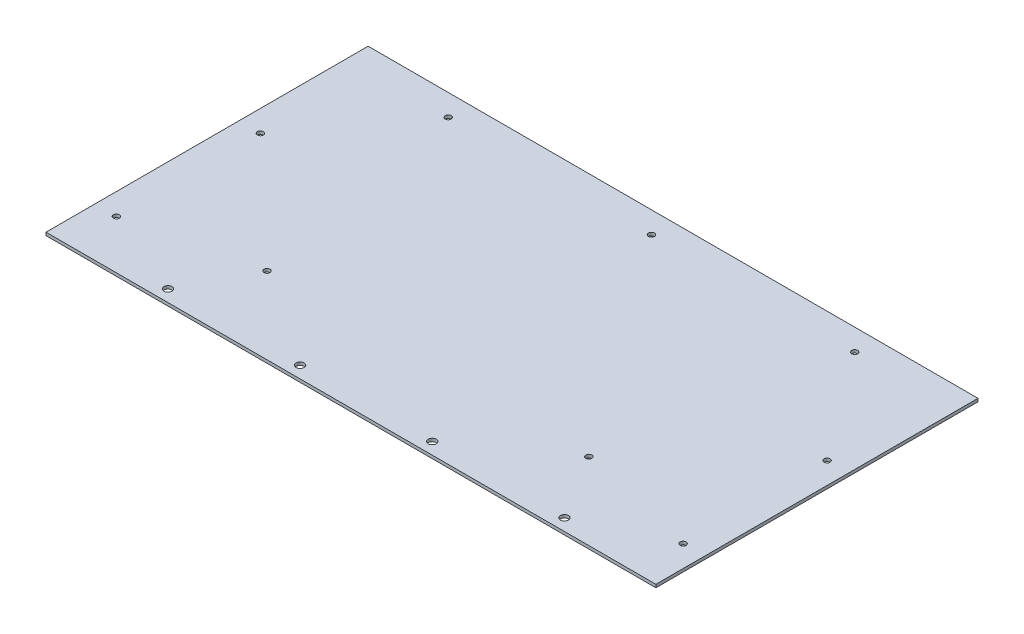
ISO-10303-21;
HEADER;
FILE_DESCRIPTION(('STEP AP214'),'2;1');
FILE_NAME('part.step','',(''),(''),'','','');
FILE_SCHEMA(('AUTOMOTIVE_DESIGN { 1 0 10303 214 1 1 1 1 }'));
ENDSEC;
DATA;
#1=APPLICATION_CONTEXT('core data for automotive mechanical design processes');
#2=APPLICATION_PROTOCOL_DEFINITION('international standard','automotive_design',2000,#1);
#3=PRODUCT_CONTEXT('',#1,'mechanical');
#4=PRODUCT('Part','Part','',(#3));
#5=PRODUCT_RELATED_PRODUCT_CATEGORY('part','',(#4));
#6=PRODUCT_DEFINITION_FORMATION('','',#4);
#7=PRODUCT_DEFINITION_CONTEXT('part definition',#1,'design');
#8=PRODUCT_DEFINITION('design','',#6,#7);
#9=PRODUCT_DEFINITION_SHAPE('','',#8);
#10=(LENGTH_UNIT() NAMED_UNIT(*) SI_UNIT(.MILLI.,.METRE.));
#11=(NAMED_UNIT(*) PLANE_ANGLE_UNIT() SI_UNIT($,.RADIAN.));
#12=(NAMED_UNIT(*) SI_UNIT($,.STERADIAN.) SOLID_ANGLE_UNIT());
#13=UNCERTAINTY_MEASURE_WITH_UNIT(LENGTH_MEASURE(1.E-05),#10,'distance_accuracy_value','');
#14=(GEOMETRIC_REPRESENTATION_CONTEXT(3) GLOBAL_UNCERTAINTY_ASSIGNED_CONTEXT((#13)) GLOBAL_UNIT_ASSIGNED_CONTEXT((#10,
#11,#12)) REPRESENTATION_CONTEXT('',''));
#15=CARTESIAN_POINT('',(0.,0.,0.));
#16=DIRECTION('',(0.,0.,1.));
#17=DIRECTION('',(1.,0.,0.));
#18=AXIS2_PLACEMENT_3D('',#15,#16,#17);
#19=CARTESIAN_POINT('',(-228.6,-1.143,238.315200026));
#20=DIRECTION('',(0.,1.,0.));
#21=DIRECTION('',(0.,0.,1.));
#22=AXIS2_PLACEMENT_3D('',#19,#20,#21);
#23=PLANE('',#22);
#24=CARTESIAN_POINT('',(-212.419,-1.143,93.7748237783918));
#25=DIRECTION('',(0.,-1.,0.));
#26=DIRECTION('',(0.,0.,-1.));
#27=AXIS2_PLACEMENT_3D('',#24,#25,#26);
#28=CIRCLE('',#27,2.25);
#29=CARTESIAN_POINT('',(-212.419,-1.143,91.5248237783918));
#30=VERTEX_POINT('',#29);
#31=EDGE_CURVE('E217',#30,#30,#28,.T.);
#32=ORIENTED_EDGE('',*,*,#31,.F.);
#33=EDGE_LOOP('',(#32));
#34=FACE_BOUND('',#33,.T.);
#35=CARTESIAN_POINT('',(-152.399999999999,-1.143,13.0175));
#36=DIRECTION('',(0.,-1.,0.));
#37=DIRECTION('',(0.,0.,-1.));
#38=AXIS2_PLACEMENT_3D('',#35,#36,#37);
#39=CIRCLE('',#38,2.25);
#40=CARTESIAN_POINT('',(-152.399999999999,-1.143,10.7675));
#41=VERTEX_POINT('',#40);
#42=EDGE_CURVE('E219',#41,#41,#39,.T.);
#43=ORIENTED_EDGE('',*,*,#42,.F.);
#44=EDGE_LOOP('',(#43));
#45=FACE_BOUND('',#44,.T.);
#46=CARTESIAN_POINT('',(1.34681673997592E-12,-1.143,13.0175));
#47=DIRECTION('',(0.,-1.,0.));
#48=DIRECTION('',(0.,0.,-1.));
#49=AXIS2_PLACEMENT_3D('',#46,#47,#48);
#50=CIRCLE('',#49,2.25);
#51=CARTESIAN_POINT('',(1.34681673997592E-12,-1.143,10.7675));
#52=VERTEX_POINT('',#51);
#53=EDGE_CURVE('E227',#52,#52,#50,.T.);
#54=ORIENTED_EDGE('',*,*,#53,.F.);
#55=EDGE_LOOP('',(#54));
#56=FACE_BOUND('',#55,.T.);
#57=CARTESIAN_POINT('',(152.400000000001,-1.143,13.0175));
#58=DIRECTION('',(0.,-1.,0.));
#59=DIRECTION('',(0.,0.,-1.));
#60=AXIS2_PLACEMENT_3D('',#57,#58,#59);
#61=CIRCLE('',#60,2.25);
#62=CARTESIAN_POINT('',(152.400000000001,-1.143,10.7675));
#63=VERTEX_POINT('',#62);
#64=EDGE_CURVE('E233',#63,#63,#61,.T.);
#65=ORIENTED_EDGE('',*,*,#64,.F.);
#66=EDGE_LOOP('',(#65));
#67=FACE_BOUND('',#66,.T.);
#68=CARTESIAN_POINT('',(212.419,-1.143,93.7748237783918));
#69=DIRECTION('',(0.,-1.,0.));
#70=DIRECTION('',(0.,0.,-1.));
#71=AXIS2_PLACEMENT_3D('',#68,#69,#70);
#72=CIRCLE('',#71,2.25);
#73=CARTESIAN_POINT('',(212.419,-1.143,91.5248237783918));
#74=VERTEX_POINT('',#73);
#75=EDGE_CURVE('E239',#74,#74,#72,.T.);
#76=ORIENTED_EDGE('',*,*,#75,.F.);
#77=EDGE_LOOP('',(#76));
#78=FACE_BOUND('',#77,.T.);
#79=CARTESIAN_POINT('',(-212.419,-1.143,201.724823778392));
#80=DIRECTION('',(0.,-1.,0.));
#81=DIRECTION('',(0.,0.,-1.));
#82=AXIS2_PLACEMENT_3D('',#79,#80,#81);
#83=CIRCLE('',#82,2.25);
#84=CARTESIAN_POINT('',(-212.419,-1.143,199.474823778392));
#85=VERTEX_POINT('',#84);
#86=EDGE_CURVE('E263',#85,#85,#83,.T.);
#87=ORIENTED_EDGE('',*,*,#86,.F.);
#88=EDGE_LOOP('',(#87));
#89=FACE_BOUND('',#88,.T.);
#90=CARTESIAN_POINT('',(-46.99,-1.143,229.425200026));
#91=DIRECTION('',(0.,1.,0.));
#92=DIRECTION('',(0.,0.,1.));
#93=AXIS2_PLACEMENT_3D('',#90,#91,#92);
#94=CIRCLE('',#93,2.99999999999999);
#95=CARTESIAN_POINT('',(-46.99,-1.143,232.425200026));
#96=VERTEX_POINT('',#95);
#97=EDGE_CURVE('E271',#96,#96,#94,.T.);
#98=ORIENTED_EDGE('',*,*,#97,.T.);
#99=EDGE_LOOP('',(#98));
#100=FACE_BOUND('',#99,.T.);
#101=CARTESIAN_POINT('',(-146.05,-1.143,229.425200026));
#102=DIRECTION('',(0.,1.,0.));
#103=DIRECTION('',(0.,0.,1.));
#104=AXIS2_PLACEMENT_3D('',#101,#102,#103);
#105=CIRCLE('',#104,2.99999999999999);
#106=CARTESIAN_POINT('',(-146.05,-1.143,232.425200026));
#107=VERTEX_POINT('',#106);
#108=EDGE_CURVE('E112',#107,#107,#105,.T.);
#109=ORIENTED_EDGE('',*,*,#108,.T.);
#110=EDGE_LOOP('',(#109));
#111=FACE_BOUND('',#110,.T.);
#112=DIRECTION('',(0.,0.,-1.));
#113=VECTOR('',#112,1.);
#114=CARTESIAN_POINT('',(-228.6,-1.143,238.315200026));
#115=LINE('',#114,#113);
#116=CARTESIAN_POINT('',(-228.6,-1.143,238.315200026));
#117=VERTEX_POINT('',#116);
#118=CARTESIAN_POINT('',(-228.6,-1.143,-3.175));
#119=VERTEX_POINT('',#118);
#120=EDGE_CURVE('E128',#117,#119,#115,.T.);
#121=ORIENTED_EDGE('',*,*,#120,.T.);
#122=DIRECTION('',(-1.,0.,0.));
#123=VECTOR('',#122,1.);
#124=CARTESIAN_POINT('',(0.,-1.143,-3.175));
#125=LINE('',#124,#123);
#126=CARTESIAN_POINT('',(228.6,-1.143,-3.175));
#127=VERTEX_POINT('',#126);
#128=EDGE_CURVE('E106',#127,#119,#125,.T.);
#129=ORIENTED_EDGE('',*,*,#128,.F.);
#130=DIRECTION('',(0.,0.,-1.));
#131=VECTOR('',#130,1.);
#132=CARTESIAN_POINT('',(228.6,-1.143,238.315200026));
#133=LINE('',#132,#131);
#134=CARTESIAN_POINT('',(228.6,-1.143,238.315200026));
#135=VERTEX_POINT('',#134);
#136=EDGE_CURVE('E102',#135,#127,#133,.T.);
#137=ORIENTED_EDGE('',*,*,#136,.F.);
#138=DIRECTION('',(1.,0.,0.));
#139=VECTOR('',#138,1.);
#140=CARTESIAN_POINT('',(-228.6,-1.143,238.315200026));
#141=LINE('',#140,#139);
#142=EDGE_CURVE('E60',#117,#135,#141,.T.);
#143=ORIENTED_EDGE('',*,*,#142,.F.);
#144=EDGE_LOOP('',(#121,#129,#137,#143));
#145=FACE_BOUND('',#144,.T.);
#146=CARTESIAN_POINT('',(52.07,-1.143,229.425200026));
#147=DIRECTION('',(0.,1.,0.));
#148=DIRECTION('',(0.,0.,1.));
#149=AXIS2_PLACEMENT_3D('',#146,#147,#148);
#150=CIRCLE('',#149,2.99999999999999);
#151=CARTESIAN_POINT('',(52.07,-1.143,232.425200026));
#152=VERTEX_POINT('',#151);
#153=EDGE_CURVE('E133',#152,#152,#150,.T.);
#154=ORIENTED_EDGE('',*,*,#153,.T.);
#155=EDGE_LOOP('',(#154));
#156=FACE_BOUND('',#155,.T.);
#157=CARTESIAN_POINT('',(151.13,-1.143,229.425200026));
#158=DIRECTION('',(0.,1.,0.));
#159=DIRECTION('',(0.,0.,1.));
#160=AXIS2_PLACEMENT_3D('',#157,#158,#159);
#161=CIRCLE('',#160,2.99999999999999);
#162=CARTESIAN_POINT('',(151.13,-1.143,232.425200026));
#163=VERTEX_POINT('',#162);
#164=EDGE_CURVE('E11',#163,#163,#161,.T.);
#165=ORIENTED_EDGE('',*,*,#164,.T.);
#166=EDGE_LOOP('',(#165));
#167=FACE_BOUND('',#166,.T.);
#168=CARTESIAN_POINT('',(-120.65,-1.143,180.586));
#169=DIRECTION('',(0.,-1.,0.));
#170=DIRECTION('',(0.,0.,-1.));
#171=AXIS2_PLACEMENT_3D('',#168,#169,#170);
#172=CIRCLE('',#171,2.25);
#173=CARTESIAN_POINT('',(-120.65,-1.143,178.336));
#174=VERTEX_POINT('',#173);
#175=EDGE_CURVE('E257',#174,#174,#172,.T.);
#176=ORIENTED_EDGE('',*,*,#175,.F.);
#177=EDGE_LOOP('',(#176));
#178=FACE_BOUND('',#177,.T.);
#179=CARTESIAN_POINT('',(120.65,-1.143,180.586));
#180=DIRECTION('',(0.,-1.,0.));
#181=DIRECTION('',(0.,0.,-1.));
#182=AXIS2_PLACEMENT_3D('',#179,#180,#181);
#183=CIRCLE('',#182,2.25);
#184=CARTESIAN_POINT('',(120.65,-1.143,178.336));
#185=VERTEX_POINT('',#184);
#186=EDGE_CURVE('E251',#185,#185,#183,.T.);
#187=ORIENTED_EDGE('',*,*,#186,.F.);
#188=EDGE_LOOP('',(#187));
#189=FACE_BOUND('',#188,.T.);
#190=CARTESIAN_POINT('',(212.419,-1.143,201.724823778392));
#191=DIRECTION('',(0.,-1.,0.));
#192=DIRECTION('',(0.,0.,-1.));
#193=AXIS2_PLACEMENT_3D('',#190,#191,#192);
#194=CIRCLE('',#193,2.25);
#195=CARTESIAN_POINT('',(212.419,-1.143,199.474823778392));
#196=VERTEX_POINT('',#195);
#197=EDGE_CURVE('E245',#196,#196,#194,.T.);
#198=ORIENTED_EDGE('',*,*,#197,.F.);
#199=EDGE_LOOP('',(#198));
#200=FACE_BOUND('',#199,.T.);
#201=ADVANCED_FACE('F45',(#34,#45,#56,#67,#78,#89,#100,#111,#145,#156,#167,#178,#189,#200),#23,.F.);
#202=CARTESIAN_POINT('',(151.13,-1.397,229.425200026));
#203=DIRECTION('',(0.,1.,0.));
#204=DIRECTION('',(0.,0.,1.));
#205=AXIS2_PLACEMENT_3D('',#202,#203,#204);
#206=CYLINDRICAL_SURFACE('',#205,2.99999999999999);
#207=CARTESIAN_POINT('',(151.13,1.143,229.425200026));
#208=DIRECTION('',(0.,1.,0.));
#209=DIRECTION('',(0.,0.,1.));
#210=AXIS2_PLACEMENT_3D('',#207,#208,#209);
#211=CIRCLE('',#210,2.99999999999999);
#212=CARTESIAN_POINT('',(151.13,1.143,232.425200026));
#213=VERTEX_POINT('',#212);
#214=EDGE_CURVE('E53',#213,#213,#211,.T.);
#215=ORIENTED_EDGE('',*,*,#214,.T.);
#216=EDGE_LOOP('',(#215));
#217=FACE_BOUND('',#216,.T.);
#218=ORIENTED_EDGE('',*,*,#164,.F.);
#219=EDGE_LOOP('',(#218));
#220=FACE_BOUND('',#219,.T.);
#221=ADVANCED_FACE('F47',(#217,#220),#206,.F.);
#222=CARTESIAN_POINT('',(52.07,-1.397,229.425200026));
#223=DIRECTION('',(0.,1.,0.));
#224=DIRECTION('',(0.,0.,1.));
#225=AXIS2_PLACEMENT_3D('',#222,#223,#224);
#226=CYLINDRICAL_SURFACE('',#225,2.99999999999999);
#227=CARTESIAN_POINT('',(52.07,1.143,229.425200026));
#228=DIRECTION('',(0.,1.,0.));
#229=DIRECTION('',(0.,0.,1.));
#230=AXIS2_PLACEMENT_3D('',#227,#228,#229);
#231=CIRCLE('',#230,2.99999999999999);
#232=CARTESIAN_POINT('',(52.07,1.143,232.425200026));
#233=VERTEX_POINT('',#232);
#234=EDGE_CURVE('E96',#233,#233,#231,.T.);
#235=ORIENTED_EDGE('',*,*,#234,.T.);
#236=EDGE_LOOP('',(#235));
#237=FACE_BOUND('',#236,.T.);
#238=ORIENTED_EDGE('',*,*,#153,.F.);
#239=EDGE_LOOP('',(#238));
#240=FACE_BOUND('',#239,.T.);
#241=ADVANCED_FACE('F153',(#237,#240),#226,.F.);
#242=CARTESIAN_POINT('',(228.6,-1.143,238.315200026));
#243=DIRECTION('',(-1.,0.,0.));
#244=DIRECTION('',(0.,0.,1.));
#245=AXIS2_PLACEMENT_3D('',#242,#243,#244);
#246=PLANE('',#245);
#247=ORIENTED_EDGE('',*,*,#136,.T.);
#248=DIRECTION('',(0.,-1.,0.));
#249=VECTOR('',#248,1.);
#250=CARTESIAN_POINT('',(228.6,0.,-3.175));
#251=LINE('',#250,#249);
#252=CARTESIAN_POINT('',(228.6,1.143,-3.175));
#253=VERTEX_POINT('',#252);
#254=EDGE_CURVE('E100',#253,#127,#251,.T.);
#255=ORIENTED_EDGE('',*,*,#254,.F.);
#256=DIRECTION('',(0.,0.,-1.));
#257=VECTOR('',#256,1.);
#258=CARTESIAN_POINT('',(228.6,1.143,238.315200026));
#259=LINE('',#258,#257);
#260=CARTESIAN_POINT('',(228.6,1.143,238.315200026));
#261=VERTEX_POINT('',#260);
#262=EDGE_CURVE('E86',#261,#253,#259,.T.);
#263=ORIENTED_EDGE('',*,*,#262,.F.);
#264=DIRECTION('',(0.,1.,0.));
#265=VECTOR('',#264,1.);
#266=CARTESIAN_POINT('',(228.6,-1.143,238.315200026));
#267=LINE('',#266,#265);
#268=EDGE_CURVE('E122',#135,#261,#267,.T.);
#269=ORIENTED_EDGE('',*,*,#268,.F.);
#270=EDGE_LOOP('',(#247,#255,#263,#269));
#271=FACE_BOUND('',#270,.T.);
#272=ADVANCED_FACE('F101',(#271),#246,.F.);
#273=CARTESIAN_POINT('',(-228.6,1.143,238.315200026));
#274=DIRECTION('',(0.,-1.,0.));
#275=DIRECTION('',(0.,0.,-1.));
#276=AXIS2_PLACEMENT_3D('',#273,#274,#275);
#277=PLANE('',#276);
#278=CARTESIAN_POINT('',(-212.419,1.143,93.7748237783918));
#279=DIRECTION('',(0.,-1.,0.));
#280=DIRECTION('',(0.,0.,-1.));
#281=AXIS2_PLACEMENT_3D('',#278,#279,#280);
#282=CIRCLE('',#281,2.25);
#283=CARTESIAN_POINT('',(-212.419,1.143,91.5248237783918));
#284=VERTEX_POINT('',#283);
#285=EDGE_CURVE('E215',#284,#284,#282,.T.);
#286=ORIENTED_EDGE('',*,*,#285,.T.);
#287=EDGE_LOOP('',(#286));
#288=FACE_BOUND('',#287,.T.);
#289=CARTESIAN_POINT('',(-152.399999999999,1.143,13.0175));
#290=DIRECTION('',(0.,-1.,0.));
#291=DIRECTION('',(0.,0.,-1.));
#292=AXIS2_PLACEMENT_3D('',#289,#290,#291);
#293=CIRCLE('',#292,2.25);
#294=CARTESIAN_POINT('',(-152.399999999999,1.143,10.7675));
#295=VERTEX_POINT('',#294);
#296=EDGE_CURVE('E224',#295,#295,#293,.T.);
#297=ORIENTED_EDGE('',*,*,#296,.T.);
#298=EDGE_LOOP('',(#297));
#299=FACE_BOUND('',#298,.T.);
#300=CARTESIAN_POINT('',(1.34681673997592E-12,1.143,13.0175));
#301=DIRECTION('',(0.,-1.,0.));
#302=DIRECTION('',(0.,0.,-1.));
#303=AXIS2_PLACEMENT_3D('',#300,#301,#302);
#304=CIRCLE('',#303,2.25);
#305=CARTESIAN_POINT('',(1.34681673997592E-12,1.143,10.7675));
#306=VERTEX_POINT('',#305);
#307=EDGE_CURVE('E230',#306,#306,#304,.T.);
#308=ORIENTED_EDGE('',*,*,#307,.T.);
#309=EDGE_LOOP('',(#308));
#310=FACE_BOUND('',#309,.T.);
#311=CARTESIAN_POINT('',(152.400000000001,1.143,13.0175));
#312=DIRECTION('',(0.,-1.,0.));
#313=DIRECTION('',(0.,0.,-1.));
#314=AXIS2_PLACEMENT_3D('',#311,#312,#313);
#315=CIRCLE('',#314,2.25);
#316=CARTESIAN_POINT('',(152.400000000001,1.143,10.7675));
#317=VERTEX_POINT('',#316);
#318=EDGE_CURVE('E236',#317,#317,#315,.T.);
#319=ORIENTED_EDGE('',*,*,#318,.T.);
#320=EDGE_LOOP('',(#319));
#321=FACE_BOUND('',#320,.T.);
#322=CARTESIAN_POINT('',(212.419,1.143,93.7748237783918));
#323=DIRECTION('',(0.,-1.,0.));
#324=DIRECTION('',(0.,0.,-1.));
#325=AXIS2_PLACEMENT_3D('',#322,#323,#324);
#326=CIRCLE('',#325,2.25);
#327=CARTESIAN_POINT('',(212.419,1.143,91.5248237783918));
#328=VERTEX_POINT('',#327);
#329=EDGE_CURVE('E242',#328,#328,#326,.T.);
#330=ORIENTED_EDGE('',*,*,#329,.T.);
#331=EDGE_LOOP('',(#330));
#332=FACE_BOUND('',#331,.T.);
#333=CARTESIAN_POINT('',(212.419,1.143,201.724823778392));
#334=DIRECTION('',(0.,-1.,0.));
#335=DIRECTION('',(0.,0.,-1.));
#336=AXIS2_PLACEMENT_3D('',#333,#334,#335);
#337=CIRCLE('',#336,2.25);
#338=CARTESIAN_POINT('',(212.419,1.143,199.474823778392));
#339=VERTEX_POINT('',#338);
#340=EDGE_CURVE('E248',#339,#339,#337,.T.);
#341=ORIENTED_EDGE('',*,*,#340,.T.);
#342=EDGE_LOOP('',(#341));
#343=FACE_BOUND('',#342,.T.);
#344=CARTESIAN_POINT('',(120.65,1.143,180.586));
#345=DIRECTION('',(0.,-1.,0.));
#346=DIRECTION('',(0.,0.,-1.));
#347=AXIS2_PLACEMENT_3D('',#344,#345,#346);
#348=CIRCLE('',#347,2.25);
#349=CARTESIAN_POINT('',(120.65,1.143,178.336));
#350=VERTEX_POINT('',#349);
#351=EDGE_CURVE('E254',#350,#350,#348,.T.);
#352=ORIENTED_EDGE('',*,*,#351,.T.);
#353=EDGE_LOOP('',(#352));
#354=FACE_BOUND('',#353,.T.);
#355=CARTESIAN_POINT('',(-120.65,1.143,180.586));
#356=DIRECTION('',(0.,-1.,0.));
#357=DIRECTION('',(0.,0.,-1.));
#358=AXIS2_PLACEMENT_3D('',#355,#356,#357);
#359=CIRCLE('',#358,2.25);
#360=CARTESIAN_POINT('',(-120.65,1.143,178.336));
#361=VERTEX_POINT('',#360);
#362=EDGE_CURVE('E260',#361,#361,#359,.T.);
#363=ORIENTED_EDGE('',*,*,#362,.T.);
#364=EDGE_LOOP('',(#363));
#365=FACE_BOUND('',#364,.T.);
#366=CARTESIAN_POINT('',(-212.419,1.143,201.724823778392));
#367=DIRECTION('',(0.,-1.,0.));
#368=DIRECTION('',(0.,0.,-1.));
#369=AXIS2_PLACEMENT_3D('',#366,#367,#368);
#370=CIRCLE('',#369,2.25);
#371=CARTESIAN_POINT('',(-212.419,1.143,199.474823778392));
#372=VERTEX_POINT('',#371);
#373=EDGE_CURVE('E266',#372,#372,#370,.T.);
#374=ORIENTED_EDGE('',*,*,#373,.T.);
#375=EDGE_LOOP('',(#374));
#376=FACE_BOUND('',#375,.T.);
#377=CARTESIAN_POINT('',(-46.99,1.143,229.425200026));
#378=DIRECTION('',(0.,1.,0.));
#379=DIRECTION('',(0.,0.,1.));
#380=AXIS2_PLACEMENT_3D('',#377,#378,#379);
#381=CIRCLE('',#380,2.99999999999999);
#382=CARTESIAN_POINT('',(-46.99,1.143,232.425200026));
#383=VERTEX_POINT('',#382);
#384=EDGE_CURVE('E269',#383,#383,#381,.T.);
#385=ORIENTED_EDGE('',*,*,#384,.F.);
#386=EDGE_LOOP('',(#385));
#387=FACE_BOUND('',#386,.T.);
#388=CARTESIAN_POINT('',(-146.05,1.143,229.425200026));
#389=DIRECTION('',(0.,1.,0.));
#390=DIRECTION('',(0.,0.,1.));
#391=AXIS2_PLACEMENT_3D('',#388,#389,#390);
#392=CIRCLE('',#391,2.99999999999999);
#393=CARTESIAN_POINT('',(-146.05,1.143,232.425200026));
#394=VERTEX_POINT('',#393);
#395=EDGE_CURVE('E115',#394,#394,#392,.T.);
#396=ORIENTED_EDGE('',*,*,#395,.F.);
#397=EDGE_LOOP('',(#396));
#398=FACE_BOUND('',#397,.T.);
#399=ORIENTED_EDGE('',*,*,#262,.T.);
#400=DIRECTION('',(1.,0.,0.));
#401=VECTOR('',#400,1.);
#402=CARTESIAN_POINT('',(0.,1.143,-3.175));
#403=LINE('',#402,#401);
#404=CARTESIAN_POINT('',(-228.6,1.143,-3.175));
#405=VERTEX_POINT('',#404);
#406=EDGE_CURVE('E92',#405,#253,#403,.T.);
#407=ORIENTED_EDGE('',*,*,#406,.F.);
#408=DIRECTION('',(0.,0.,-1.));
#409=VECTOR('',#408,1.);
#410=CARTESIAN_POINT('',(-228.6,1.143,238.315200026));
#411=LINE('',#410,#409);
#412=CARTESIAN_POINT('',(-228.6,1.143,238.315200026));
#413=VERTEX_POINT('',#412);
#414=EDGE_CURVE('E97',#413,#405,#411,.T.);
#415=ORIENTED_EDGE('',*,*,#414,.F.);
#416=DIRECTION('',(-1.,0.,0.));
#417=VECTOR('',#416,1.);
#418=CARTESIAN_POINT('',(-228.6,1.143,238.315200026));
#419=LINE('',#418,#417);
#420=EDGE_CURVE('E93',#261,#413,#419,.T.);
#421=ORIENTED_EDGE('',*,*,#420,.F.);
#422=EDGE_LOOP('',(#399,#407,#415,#421));
#423=FACE_BOUND('',#422,.T.);
#424=ORIENTED_EDGE('',*,*,#234,.F.);
#425=EDGE_LOOP('',(#424));
#426=FACE_BOUND('',#425,.T.);
#427=ORIENTED_EDGE('',*,*,#214,.F.);
#428=EDGE_LOOP('',(#427));
#429=FACE_BOUND('',#428,.T.);
#430=ADVANCED_FACE('F88',(#288,#299,#310,#321,#332,#343,#354,#365,#376,#387,#398,#423,#426,
#429),#277,.F.);
#431=CARTESIAN_POINT('',(-228.6,-1.143,238.315200026));
#432=DIRECTION('',(1.,0.,0.));
#433=DIRECTION('',(0.,0.,-1.));
#434=AXIS2_PLACEMENT_3D('',#431,#432,#433);
#435=PLANE('',#434);
#436=ORIENTED_EDGE('',*,*,#414,.T.);
#437=DIRECTION('',(0.,1.,0.));
#438=VECTOR('',#437,1.);
#439=CARTESIAN_POINT('',(-228.6,0.,-3.175));
#440=LINE('',#439,#438);
#441=EDGE_CURVE('E111',#119,#405,#440,.T.);
#442=ORIENTED_EDGE('',*,*,#441,.F.);
#443=ORIENTED_EDGE('',*,*,#120,.F.);
#444=DIRECTION('',(0.,-1.,0.));
#445=VECTOR('',#444,1.);
#446=CARTESIAN_POINT('',(-228.6,-1.143,238.315200026));
#447=LINE('',#446,#445);
#448=EDGE_CURVE('E65',#413,#117,#447,.T.);
#449=ORIENTED_EDGE('',*,*,#448,.F.);
#450=EDGE_LOOP('',(#436,#442,#443,#449));
#451=FACE_BOUND('',#450,.T.);
#452=ADVANCED_FACE('F141',(#451),#435,.F.);
#453=CARTESIAN_POINT('',(0.,0.,238.315200026));
#454=DIRECTION('',(0.,0.,-1.));
#455=DIRECTION('',(-1.,0.,0.));
#456=AXIS2_PLACEMENT_3D('',#453,#454,#455);
#457=PLANE('',#456);
#458=ORIENTED_EDGE('',*,*,#268,.T.);
#459=ORIENTED_EDGE('',*,*,#420,.T.);
#460=ORIENTED_EDGE('',*,*,#448,.T.);
#461=ORIENTED_EDGE('',*,*,#142,.T.);
#462=EDGE_LOOP('',(#458,#459,#460,#461));
#463=FACE_BOUND('',#462,.T.);
#464=ADVANCED_FACE('F149',(#463),#457,.F.);
#465=CARTESIAN_POINT('',(0.,0.,-3.175));
#466=DIRECTION('',(0.,0.,-1.));
#467=DIRECTION('',(-1.,0.,0.));
#468=AXIS2_PLACEMENT_3D('',#465,#466,#467);
#469=PLANE('',#468);
#470=ORIENTED_EDGE('',*,*,#406,.T.);
#471=ORIENTED_EDGE('',*,*,#254,.T.);
#472=ORIENTED_EDGE('',*,*,#128,.T.);
#473=ORIENTED_EDGE('',*,*,#441,.T.);
#474=EDGE_LOOP('',(#470,#471,#472,#473));
#475=FACE_BOUND('',#474,.T.);
#476=ADVANCED_FACE('F109',(#475),#469,.T.);
#477=CARTESIAN_POINT('',(-146.05,-1.397,229.425200026));
#478=DIRECTION('',(0.,1.,0.));
#479=DIRECTION('',(0.,0.,1.));
#480=AXIS2_PLACEMENT_3D('',#477,#478,#479);
#481=CYLINDRICAL_SURFACE('',#480,2.99999999999999);
#482=ORIENTED_EDGE('',*,*,#395,.T.);
#483=EDGE_LOOP('',(#482));
#484=FACE_BOUND('',#483,.T.);
#485=ORIENTED_EDGE('',*,*,#108,.F.);
#486=EDGE_LOOP('',(#485));
#487=FACE_BOUND('',#486,.T.);
#488=ADVANCED_FACE('F170',(#484,#487),#481,.F.);
#489=CARTESIAN_POINT('',(-46.99,-1.397,229.425200026));
#490=DIRECTION('',(0.,1.,0.));
#491=DIRECTION('',(0.,0.,1.));
#492=AXIS2_PLACEMENT_3D('',#489,#490,#491);
#493=CYLINDRICAL_SURFACE('',#492,2.99999999999999);
#494=ORIENTED_EDGE('',*,*,#384,.T.);
#495=EDGE_LOOP('',(#494));
#496=FACE_BOUND('',#495,.T.);
#497=ORIENTED_EDGE('',*,*,#97,.F.);
#498=EDGE_LOOP('',(#497));
#499=FACE_BOUND('',#498,.T.);
#500=ADVANCED_FACE('F173',(#496,#499),#493,.F.);
#501=CARTESIAN_POINT('',(-212.419,-1.143,201.724823778392));
#502=DIRECTION('',(0.,-1.,0.));
#503=DIRECTION('',(0.,0.,-1.));
#504=AXIS2_PLACEMENT_3D('',#501,#502,#503);
#505=CYLINDRICAL_SURFACE('',#504,2.25);
#506=ORIENTED_EDGE('',*,*,#373,.F.);
#507=EDGE_LOOP('',(#506));
#508=FACE_BOUND('',#507,.T.);
#509=ORIENTED_EDGE('',*,*,#86,.T.);
#510=EDGE_LOOP('',(#509));
#511=FACE_BOUND('',#510,.T.);
#512=ADVANCED_FACE('F176',(#508,#511),#505,.F.);
#513=CARTESIAN_POINT('',(-120.65,-1.143,180.586));
#514=DIRECTION('',(0.,-1.,0.));
#515=DIRECTION('',(0.,0.,-1.));
#516=AXIS2_PLACEMENT_3D('',#513,#514,#515);
#517=CYLINDRICAL_SURFACE('',#516,2.25);
#518=ORIENTED_EDGE('',*,*,#362,.F.);
#519=EDGE_LOOP('',(#518));
#520=FACE_BOUND('',#519,.T.);
#521=ORIENTED_EDGE('',*,*,#175,.T.);
#522=EDGE_LOOP('',(#521));
#523=FACE_BOUND('',#522,.T.);
#524=ADVANCED_FACE('F179',(#520,#523),#517,.F.);
#525=CARTESIAN_POINT('',(120.65,-1.143,180.586));
#526=DIRECTION('',(0.,-1.,0.));
#527=DIRECTION('',(0.,0.,-1.));
#528=AXIS2_PLACEMENT_3D('',#525,#526,#527);
#529=CYLINDRICAL_SURFACE('',#528,2.25);
#530=ORIENTED_EDGE('',*,*,#351,.F.);
#531=EDGE_LOOP('',(#530));
#532=FACE_BOUND('',#531,.T.);
#533=ORIENTED_EDGE('',*,*,#186,.T.);
#534=EDGE_LOOP('',(#533));
#535=FACE_BOUND('',#534,.T.);
#536=ADVANCED_FACE('F183',(#532,#535),#529,.F.);
#537=CARTESIAN_POINT('',(212.419,-1.143,201.724823778392));
#538=DIRECTION('',(0.,-1.,0.));
#539=DIRECTION('',(0.,0.,-1.));
#540=AXIS2_PLACEMENT_3D('',#537,#538,#539);
#541=CYLINDRICAL_SURFACE('',#540,2.25);
#542=ORIENTED_EDGE('',*,*,#340,.F.);
#543=EDGE_LOOP('',(#542));
#544=FACE_BOUND('',#543,.T.);
#545=ORIENTED_EDGE('',*,*,#197,.T.);
#546=EDGE_LOOP('',(#545));
#547=FACE_BOUND('',#546,.T.);
#548=ADVANCED_FACE('F187',(#544,#547),#541,.F.);
#549=CARTESIAN_POINT('',(212.419,-1.143,93.7748237783918));
#550=DIRECTION('',(0.,-1.,0.));
#551=DIRECTION('',(0.,0.,-1.));
#552=AXIS2_PLACEMENT_3D('',#549,#550,#551);
#553=CYLINDRICAL_SURFACE('',#552,2.25);
#554=ORIENTED_EDGE('',*,*,#329,.F.);
#555=EDGE_LOOP('',(#554));
#556=FACE_BOUND('',#555,.T.);
#557=ORIENTED_EDGE('',*,*,#75,.T.);
#558=EDGE_LOOP('',(#557));
#559=FACE_BOUND('',#558,.T.);
#560=ADVANCED_FACE('F191',(#556,#559),#553,.F.);
#561=CARTESIAN_POINT('',(152.400000000001,-1.143,13.0175));
#562=DIRECTION('',(0.,-1.,0.));
#563=DIRECTION('',(0.,0.,-1.));
#564=AXIS2_PLACEMENT_3D('',#561,#562,#563);
#565=CYLINDRICAL_SURFACE('',#564,2.25);
#566=ORIENTED_EDGE('',*,*,#318,.F.);
#567=EDGE_LOOP('',(#566));
#568=FACE_BOUND('',#567,.T.);
#569=ORIENTED_EDGE('',*,*,#64,.T.);
#570=EDGE_LOOP('',(#569));
#571=FACE_BOUND('',#570,.T.);
#572=ADVANCED_FACE('F195',(#568,#571),#565,.F.);
#573=CARTESIAN_POINT('',(1.34681673997592E-12,-1.143,13.0175));
#574=DIRECTION('',(0.,-1.,0.));
#575=DIRECTION('',(0.,0.,-1.));
#576=AXIS2_PLACEMENT_3D('',#573,#574,#575);
#577=CYLINDRICAL_SURFACE('',#576,2.25);
#578=ORIENTED_EDGE('',*,*,#307,.F.);
#579=EDGE_LOOP('',(#578));
#580=FACE_BOUND('',#579,.T.);
#581=ORIENTED_EDGE('',*,*,#53,.T.);
#582=EDGE_LOOP('',(#581));
#583=FACE_BOUND('',#582,.T.);
#584=ADVANCED_FACE('F199',(#580,#583),#577,.F.);
#585=CARTESIAN_POINT('',(-152.399999999999,-1.143,13.0175));
#586=DIRECTION('',(0.,-1.,0.));
#587=DIRECTION('',(0.,0.,-1.));
#588=AXIS2_PLACEMENT_3D('',#585,#586,#587);
#589=CYLINDRICAL_SURFACE('',#588,2.25);
#590=ORIENTED_EDGE('',*,*,#296,.F.);
#591=EDGE_LOOP('',(#590));
#592=FACE_BOUND('',#591,.T.);
#593=ORIENTED_EDGE('',*,*,#42,.T.);
#594=EDGE_LOOP('',(#593));
#595=FACE_BOUND('',#594,.T.);
#596=ADVANCED_FACE('F203',(#592,#595),#589,.F.);
#597=CARTESIAN_POINT('',(-212.419,-1.143,93.7748237783918));
#598=DIRECTION('',(0.,-1.,0.));
#599=DIRECTION('',(0.,0.,-1.));
#600=AXIS2_PLACEMENT_3D('',#597,#598,#599);
#601=CYLINDRICAL_SURFACE('',#600,2.25);
#602=ORIENTED_EDGE('',*,*,#285,.F.);
#603=EDGE_LOOP('',(#602));
#604=FACE_BOUND('',#603,.T.);
#605=ORIENTED_EDGE('',*,*,#31,.T.);
#606=EDGE_LOOP('',(#605));
#607=FACE_BOUND('',#606,.T.);
#608=ADVANCED_FACE('F207',(#604,#607),#601,.F.);
#609=CLOSED_SHELL('',(#201,#221,#241,#272,#430,#452,#464,#476,#488,#500,#512,#524,#536,#548,
#560,#572,#584,#596,#608));
#610=MANIFOLD_SOLID_BREP('B2',#609);
#611=ADVANCED_BREP_SHAPE_REPRESENTATION('',(#18,#610),#14);
#612=SHAPE_DEFINITION_REPRESENTATION(#9,#611);
ENDSEC;
END-ISO-10303-21;
